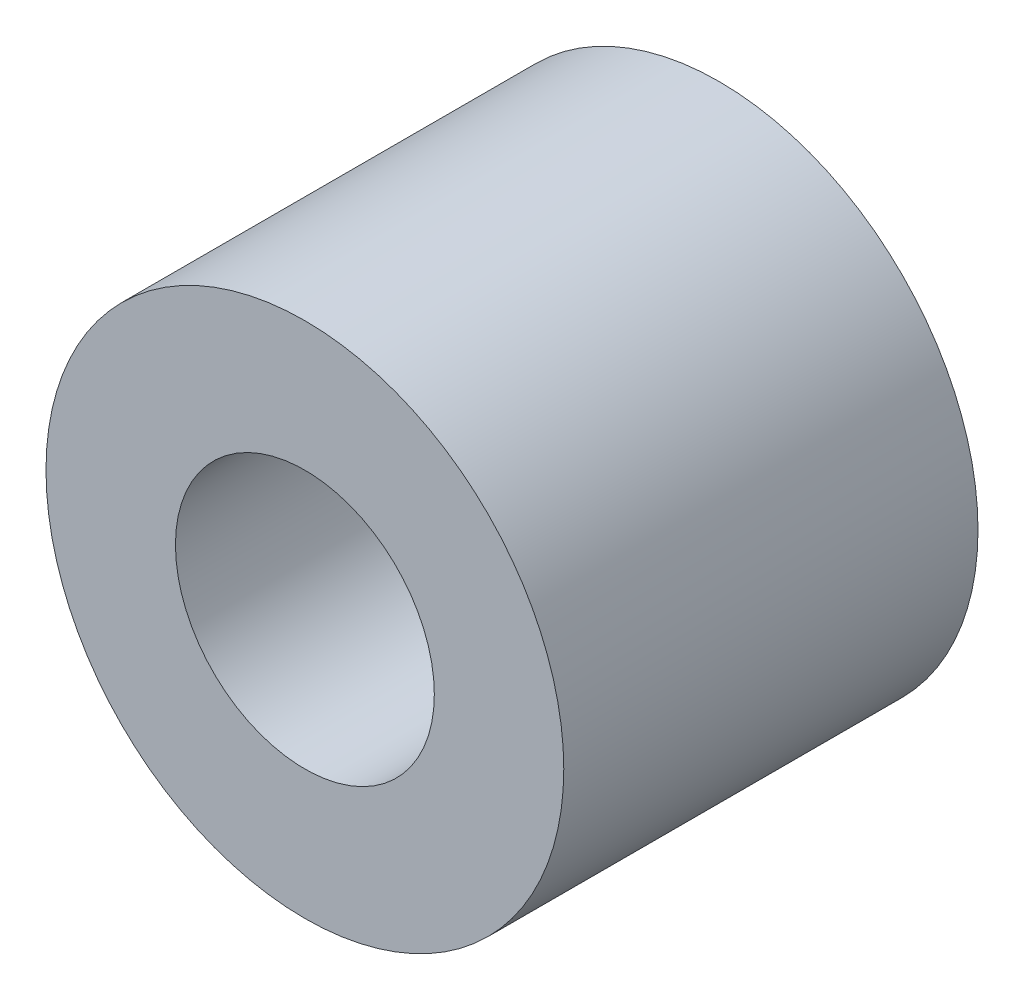
ISO-10303-21;
HEADER;
FILE_DESCRIPTION(('STEP AP214'),'2;1');
FILE_NAME('part.step','',(''),(''),'','','');
FILE_SCHEMA(('AUTOMOTIVE_DESIGN { 1 0 10303 214 1 1 1 1 }'));
ENDSEC;
DATA;
#1=APPLICATION_CONTEXT('core data for automotive mechanical design processes');
#2=APPLICATION_PROTOCOL_DEFINITION('international standard','automotive_design',2000,#1);
#3=PRODUCT_CONTEXT('',#1,'mechanical');
#4=PRODUCT('Part','Part','',(#3));
#5=PRODUCT_RELATED_PRODUCT_CATEGORY('part','',(#4));
#6=PRODUCT_DEFINITION_FORMATION('','',#4);
#7=PRODUCT_DEFINITION_CONTEXT('part definition',#1,'design');
#8=PRODUCT_DEFINITION('design','',#6,#7);
#9=PRODUCT_DEFINITION_SHAPE('','',#8);
#10=(LENGTH_UNIT() NAMED_UNIT(*) SI_UNIT(.MILLI.,.METRE.));
#11=(NAMED_UNIT(*) PLANE_ANGLE_UNIT() SI_UNIT($,.RADIAN.));
#12=(NAMED_UNIT(*) SI_UNIT($,.STERADIAN.) SOLID_ANGLE_UNIT());
#13=UNCERTAINTY_MEASURE_WITH_UNIT(LENGTH_MEASURE(1.E-05),#10,'distance_accuracy_value','');
#14=(GEOMETRIC_REPRESENTATION_CONTEXT(3) GLOBAL_UNCERTAINTY_ASSIGNED_CONTEXT((#13)) GLOBAL_UNIT_ASSIGNED_CONTEXT((#10,
#11,#12)) REPRESENTATION_CONTEXT('',''));
#15=CARTESIAN_POINT('',(0.,0.,0.));
#16=DIRECTION('',(0.,0.,1.));
#17=DIRECTION('',(1.,0.,0.));
#18=AXIS2_PLACEMENT_3D('',#15,#16,#17);
#19=CARTESIAN_POINT('',(0.,15.875,10.16));
#20=DIRECTION('',(0.,0.,1.));
#21=DIRECTION('',(1.,0.,0.));
#22=AXIS2_PLACEMENT_3D('',#19,#20,#21);
#23=PLANE('',#22);
#24=CARTESIAN_POINT('',(0.,15.875,10.16));
#25=DIRECTION('',(0.,0.,1.));
#26=DIRECTION('',(1.,0.,0.));
#27=AXIS2_PLACEMENT_3D('',#24,#25,#26);
#28=CIRCLE('',#27,6.35);
#29=CARTESIAN_POINT('',(6.35,15.875,10.16));
#30=VERTEX_POINT('',#29);
#31=EDGE_CURVE('E10',#30,#30,#28,.T.);
#32=ORIENTED_EDGE('',*,*,#31,.T.);
#33=EDGE_LOOP('',(#32));
#34=FACE_BOUND('',#33,.T.);
#35=CARTESIAN_POINT('',(0.,15.875,10.16));
#36=DIRECTION('',(0.,0.,1.));
#37=DIRECTION('',(1.,0.,0.));
#38=AXIS2_PLACEMENT_3D('',#35,#36,#37);
#39=CIRCLE('',#38,3.175);
#40=CARTESIAN_POINT('',(3.175,15.875,10.16));
#41=VERTEX_POINT('',#40);
#42=EDGE_CURVE('E42',#41,#41,#39,.T.);
#43=ORIENTED_EDGE('',*,*,#42,.F.);
#44=EDGE_LOOP('',(#43));
#45=FACE_BOUND('',#44,.T.);
#46=ADVANCED_FACE('F31',(#34,#45),#23,.T.);
#47=CARTESIAN_POINT('',(0.,15.875,0.));
#48=DIRECTION('',(0.,0.,1.));
#49=DIRECTION('',(1.,0.,0.));
#50=AXIS2_PLACEMENT_3D('',#47,#48,#49);
#51=PLANE('',#50);
#52=CARTESIAN_POINT('',(0.,15.875,0.));
#53=DIRECTION('',(0.,0.,1.));
#54=DIRECTION('',(1.,0.,0.));
#55=AXIS2_PLACEMENT_3D('',#52,#53,#54);
#56=CIRCLE('',#55,6.35);
#57=CARTESIAN_POINT('',(6.35,15.875,0.));
#58=VERTEX_POINT('',#57);
#59=EDGE_CURVE('E35',#58,#58,#56,.T.);
#60=ORIENTED_EDGE('',*,*,#59,.F.);
#61=EDGE_LOOP('',(#60));
#62=FACE_BOUND('',#61,.T.);
#63=CARTESIAN_POINT('',(0.,15.875,0.));
#64=DIRECTION('',(0.,0.,1.));
#65=DIRECTION('',(1.,0.,0.));
#66=AXIS2_PLACEMENT_3D('',#63,#64,#65);
#67=CIRCLE('',#66,3.175);
#68=CARTESIAN_POINT('',(3.175,15.875,0.));
#69=VERTEX_POINT('',#68);
#70=EDGE_CURVE('E44',#69,#69,#67,.T.);
#71=ORIENTED_EDGE('',*,*,#70,.T.);
#72=EDGE_LOOP('',(#71));
#73=FACE_BOUND('',#72,.T.);
#74=ADVANCED_FACE('F54',(#62,#73),#51,.F.);
#75=CARTESIAN_POINT('',(0.,15.875,10.16));
#76=DIRECTION('',(0.,0.,-1.));
#77=DIRECTION('',(-1.,0.,0.));
#78=AXIS2_PLACEMENT_3D('',#75,#76,#77);
#79=CYLINDRICAL_SURFACE('',#78,6.35);
#80=ORIENTED_EDGE('',*,*,#31,.F.);
#81=EDGE_LOOP('',(#80));
#82=FACE_BOUND('',#81,.T.);
#83=ORIENTED_EDGE('',*,*,#59,.T.);
#84=EDGE_LOOP('',(#83));
#85=FACE_BOUND('',#84,.T.);
#86=ADVANCED_FACE('F33',(#82,#85),#79,.T.);
#87=CARTESIAN_POINT('',(0.,15.875,10.16));
#88=DIRECTION('',(0.,0.,-1.));
#89=DIRECTION('',(-1.,0.,0.));
#90=AXIS2_PLACEMENT_3D('',#87,#88,#89);
#91=CYLINDRICAL_SURFACE('',#90,3.175);
#92=ORIENTED_EDGE('',*,*,#42,.T.);
#93=EDGE_LOOP('',(#92));
#94=FACE_BOUND('',#93,.T.);
#95=ORIENTED_EDGE('',*,*,#70,.F.);
#96=EDGE_LOOP('',(#95));
#97=FACE_BOUND('',#96,.T.);
#98=ADVANCED_FACE('F50',(#94,#97),#91,.F.);
#99=CLOSED_SHELL('',(#46,#74,#86,#98));
#100=MANIFOLD_SOLID_BREP('B2',#99);
#101=ADVANCED_BREP_SHAPE_REPRESENTATION('',(#18,#100),#14);
#102=SHAPE_DEFINITION_REPRESENTATION(#9,#101);
ENDSEC;
END-ISO-10303-21;
